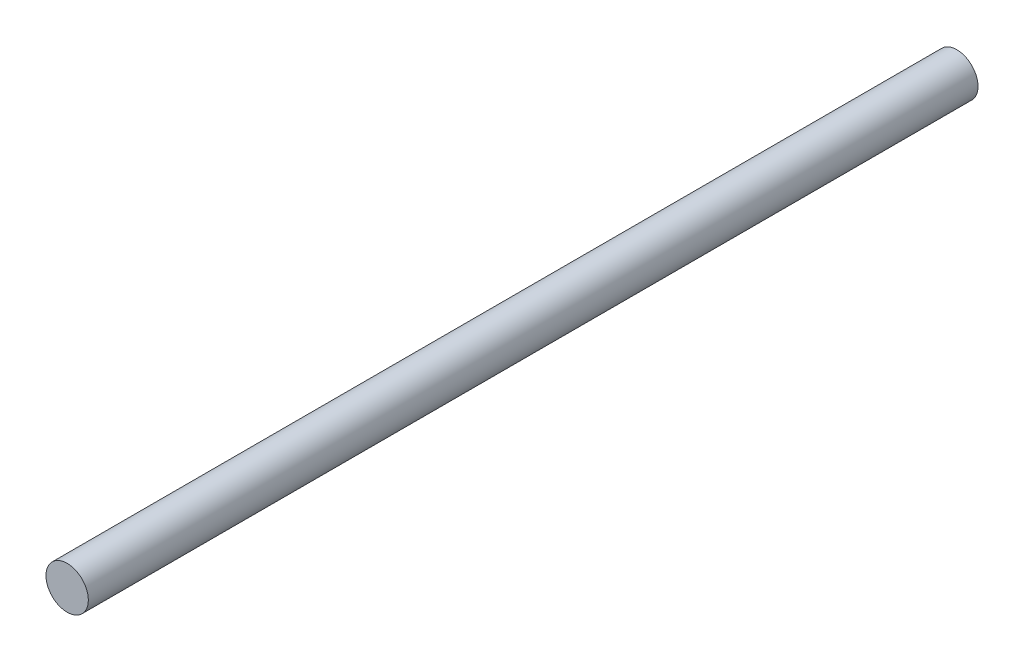
ISO-10303-21;
HEADER;
FILE_DESCRIPTION(('STEP AP214'),'2;1');
FILE_NAME('part.step','',(''),(''),'','','');
FILE_SCHEMA(('AUTOMOTIVE_DESIGN { 1 0 10303 214 1 1 1 1 }'));
ENDSEC;
DATA;
#1=APPLICATION_CONTEXT('core data for automotive mechanical design processes');
#2=APPLICATION_PROTOCOL_DEFINITION('international standard','automotive_design',2000,#1);
#3=PRODUCT_CONTEXT('',#1,'mechanical');
#4=PRODUCT('Part','Part','',(#3));
#5=PRODUCT_RELATED_PRODUCT_CATEGORY('part','',(#4));
#6=PRODUCT_DEFINITION_FORMATION('','',#4);
#7=PRODUCT_DEFINITION_CONTEXT('part definition',#1,'design');
#8=PRODUCT_DEFINITION('design','',#6,#7);
#9=PRODUCT_DEFINITION_SHAPE('','',#8);
#10=(LENGTH_UNIT() NAMED_UNIT(*) SI_UNIT(.MILLI.,.METRE.));
#11=(NAMED_UNIT(*) PLANE_ANGLE_UNIT() SI_UNIT($,.RADIAN.));
#12=(NAMED_UNIT(*) SI_UNIT($,.STERADIAN.) SOLID_ANGLE_UNIT());
#13=UNCERTAINTY_MEASURE_WITH_UNIT(LENGTH_MEASURE(1.E-05),#10,'distance_accuracy_value','');
#14=(GEOMETRIC_REPRESENTATION_CONTEXT(3) GLOBAL_UNCERTAINTY_ASSIGNED_CONTEXT((#13)) GLOBAL_UNIT_ASSIGNED_CONTEXT((#10,
#11,#12)) REPRESENTATION_CONTEXT('',''));
#15=CARTESIAN_POINT('',(0.,0.,0.));
#16=DIRECTION('',(0.,0.,1.));
#17=DIRECTION('',(1.,0.,0.));
#18=AXIS2_PLACEMENT_3D('',#15,#16,#17);
#19=CARTESIAN_POINT('',(0.,0.,105.));
#20=DIRECTION('',(0.,0.,-1.));
#21=DIRECTION('',(-1.,0.,0.));
#22=AXIS2_PLACEMENT_3D('',#19,#20,#21);
#23=CYLINDRICAL_SURFACE('',#22,2.5);
#24=CARTESIAN_POINT('',(0.,0.,105.));
#25=DIRECTION('',(0.,0.,1.));
#26=DIRECTION('',(1.,0.,0.));
#27=AXIS2_PLACEMENT_3D('',#24,#25,#26);
#28=CIRCLE('',#27,2.5);
#29=CARTESIAN_POINT('',(2.5,0.,105.));
#30=VERTEX_POINT('',#29);
#31=EDGE_CURVE('E10',#30,#30,#28,.T.);
#32=ORIENTED_EDGE('',*,*,#31,.F.);
#33=EDGE_LOOP('',(#32));
#34=FACE_BOUND('',#33,.T.);
#35=CARTESIAN_POINT('',(0.,0.,0.));
#36=DIRECTION('',(0.,0.,1.));
#37=DIRECTION('',(1.,0.,0.));
#38=AXIS2_PLACEMENT_3D('',#35,#36,#37);
#39=CIRCLE('',#38,2.5);
#40=CARTESIAN_POINT('',(2.5,0.,0.));
#41=VERTEX_POINT('',#40);
#42=EDGE_CURVE('E30',#41,#41,#39,.T.);
#43=ORIENTED_EDGE('',*,*,#42,.T.);
#44=EDGE_LOOP('',(#43));
#45=FACE_BOUND('',#44,.T.);
#46=ADVANCED_FACE('F27',(#34,#45),#23,.T.);
#47=CARTESIAN_POINT('',(0.,0.,105.));
#48=DIRECTION('',(0.,0.,1.));
#49=DIRECTION('',(1.,0.,0.));
#50=AXIS2_PLACEMENT_3D('',#47,#48,#49);
#51=PLANE('',#50);
#52=ORIENTED_EDGE('',*,*,#31,.T.);
#53=EDGE_LOOP('',(#52));
#54=FACE_BOUND('',#53,.T.);
#55=ADVANCED_FACE('F42',(#54),#51,.T.);
#56=CARTESIAN_POINT('',(0.,0.,0.));
#57=DIRECTION('',(0.,0.,1.));
#58=DIRECTION('',(1.,0.,0.));
#59=AXIS2_PLACEMENT_3D('',#56,#57,#58);
#60=PLANE('',#59);
#61=ORIENTED_EDGE('',*,*,#42,.F.);
#62=EDGE_LOOP('',(#61));
#63=FACE_BOUND('',#62,.T.);
#64=ADVANCED_FACE('F40',(#63),#60,.F.);
#65=CLOSED_SHELL('',(#46,#55,#64));
#66=MANIFOLD_SOLID_BREP('B2',#65);
#67=ADVANCED_BREP_SHAPE_REPRESENTATION('',(#18,#66),#14);
#68=SHAPE_DEFINITION_REPRESENTATION(#9,#67);
ENDSEC;
END-ISO-10303-21;
